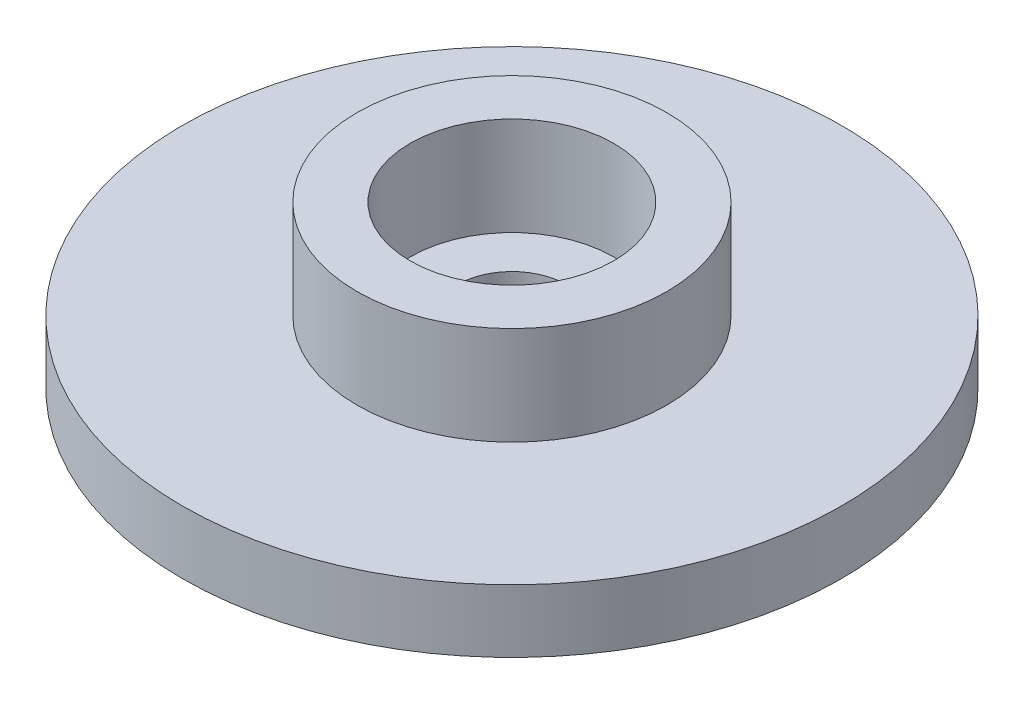
ISO-10303-21;
HEADER;
FILE_DESCRIPTION(('STEP AP214'),'2;1');
FILE_NAME('part.step','',(''),(''),'','','');
FILE_SCHEMA(('AUTOMOTIVE_DESIGN { 1 0 10303 214 1 1 1 1 }'));
ENDSEC;
DATA;
#1=APPLICATION_CONTEXT('core data for automotive mechanical design processes');
#2=APPLICATION_PROTOCOL_DEFINITION('international standard','automotive_design',2000,#1);
#3=PRODUCT_CONTEXT('',#1,'mechanical');
#4=PRODUCT('Part','Part','',(#3));
#5=PRODUCT_RELATED_PRODUCT_CATEGORY('part','',(#4));
#6=PRODUCT_DEFINITION_FORMATION('','',#4);
#7=PRODUCT_DEFINITION_CONTEXT('part definition',#1,'design');
#8=PRODUCT_DEFINITION('design','',#6,#7);
#9=PRODUCT_DEFINITION_SHAPE('','',#8);
#10=(LENGTH_UNIT() NAMED_UNIT(*) SI_UNIT(.MILLI.,.METRE.));
#11=(NAMED_UNIT(*) PLANE_ANGLE_UNIT() SI_UNIT($,.RADIAN.));
#12=(NAMED_UNIT(*) SI_UNIT($,.STERADIAN.) SOLID_ANGLE_UNIT());
#13=UNCERTAINTY_MEASURE_WITH_UNIT(LENGTH_MEASURE(1.E-05),#10,'distance_accuracy_value','');
#14=(GEOMETRIC_REPRESENTATION_CONTEXT(3) GLOBAL_UNCERTAINTY_ASSIGNED_CONTEXT((#13)) GLOBAL_UNIT_ASSIGNED_CONTEXT((#10,
#11,#12)) REPRESENTATION_CONTEXT('',''));
#15=CARTESIAN_POINT('',(0.,0.,0.));
#16=DIRECTION('',(0.,0.,1.));
#17=DIRECTION('',(1.,0.,0.));
#18=AXIS2_PLACEMENT_3D('',#15,#16,#17);
#19=CARTESIAN_POINT('',(0.,1.6256,0.));
#20=DIRECTION('',(0.,-1.,0.));
#21=DIRECTION('',(0.,0.,-1.));
#22=AXIS2_PLACEMENT_3D('',#19,#20,#21);
#23=CYLINDRICAL_SURFACE('',#22,8.509);
#24=CARTESIAN_POINT('',(0.,1.6256,0.));
#25=DIRECTION('',(0.,1.,0.));
#26=DIRECTION('',(0.,0.,1.));
#27=AXIS2_PLACEMENT_3D('',#24,#25,#26);
#28=CIRCLE('',#27,8.509);
#29=CARTESIAN_POINT('',(0.,1.6256,8.509));
#30=VERTEX_POINT('',#29);
#31=EDGE_CURVE('E51',#30,#30,#28,.T.);
#32=ORIENTED_EDGE('',*,*,#31,.F.);
#33=EDGE_LOOP('',(#32));
#34=FACE_BOUND('',#33,.T.);
#35=CARTESIAN_POINT('',(0.,0.,0.));
#36=DIRECTION('',(0.,1.,0.));
#37=DIRECTION('',(0.,0.,1.));
#38=AXIS2_PLACEMENT_3D('',#35,#36,#37);
#39=CIRCLE('',#38,8.509);
#40=CARTESIAN_POINT('',(0.,0.,8.509));
#41=VERTEX_POINT('',#40);
#42=EDGE_CURVE('E60',#41,#41,#39,.T.);
#43=ORIENTED_EDGE('',*,*,#42,.T.);
#44=EDGE_LOOP('',(#43));
#45=FACE_BOUND('',#44,.T.);
#46=ADVANCED_FACE('F37',(#34,#45),#23,.T.);
#47=CARTESIAN_POINT('',(0.,1.6256,0.));
#48=DIRECTION('',(0.,1.,0.));
#49=DIRECTION('',(0.,0.,1.));
#50=AXIS2_PLACEMENT_3D('',#47,#48,#49);
#51=PLANE('',#50);
#52=CARTESIAN_POINT('',(0.,1.6256,0.));
#53=DIRECTION('',(0.,1.,0.));
#54=DIRECTION('',(0.,0.,1.));
#55=AXIS2_PLACEMENT_3D('',#52,#53,#54);
#56=CIRCLE('',#55,4.0005);
#57=CARTESIAN_POINT('',(0.,1.6256,4.0005));
#58=VERTEX_POINT('',#57);
#59=EDGE_CURVE('E45',#58,#58,#56,.T.);
#60=ORIENTED_EDGE('',*,*,#59,.F.);
#61=EDGE_LOOP('',(#60));
#62=FACE_BOUND('',#61,.T.);
#63=ORIENTED_EDGE('',*,*,#31,.T.);
#64=EDGE_LOOP('',(#63));
#65=FACE_BOUND('',#64,.T.);
#66=ADVANCED_FACE('F72',(#62,#65),#51,.T.);
#67=CARTESIAN_POINT('',(0.,0.,0.));
#68=DIRECTION('',(0.,1.,0.));
#69=DIRECTION('',(0.,0.,1.));
#70=AXIS2_PLACEMENT_3D('',#67,#68,#69);
#71=PLANE('',#70);
#72=CARTESIAN_POINT('',(0.,0.,0.));
#73=DIRECTION('',(0.,-1.,0.));
#74=DIRECTION('',(0.,0.,-1.));
#75=AXIS2_PLACEMENT_3D('',#72,#73,#74);
#76=CIRCLE('',#75,3.5179);
#77=CARTESIAN_POINT('',(0.,0.,3.5179));
#78=VERTEX_POINT('',#77);
#79=EDGE_CURVE('E10',#78,#78,#76,.T.);
#80=ORIENTED_EDGE('',*,*,#79,.F.);
#81=EDGE_LOOP('',(#80));
#82=FACE_BOUND('',#81,.T.);
#83=ORIENTED_EDGE('',*,*,#42,.F.);
#84=EDGE_LOOP('',(#83));
#85=FACE_BOUND('',#84,.T.);
#86=ADVANCED_FACE('F69',(#82,#85),#71,.F.);
#87=CARTESIAN_POINT('',(0.,4.1656,0.));
#88=DIRECTION('',(0.,-1.,0.));
#89=DIRECTION('',(0.,0.,-1.));
#90=AXIS2_PLACEMENT_3D('',#87,#88,#89);
#91=CYLINDRICAL_SURFACE('',#90,4.0005);
#92=CARTESIAN_POINT('',(0.,4.1656,0.));
#93=DIRECTION('',(0.,1.,0.));
#94=DIRECTION('',(0.,0.,1.));
#95=AXIS2_PLACEMENT_3D('',#92,#93,#94);
#96=CIRCLE('',#95,4.0005);
#97=CARTESIAN_POINT('',(0.,4.1656,4.0005));
#98=VERTEX_POINT('',#97);
#99=EDGE_CURVE('E57',#98,#98,#96,.T.);
#100=ORIENTED_EDGE('',*,*,#99,.F.);
#101=EDGE_LOOP('',(#100));
#102=FACE_BOUND('',#101,.T.);
#103=ORIENTED_EDGE('',*,*,#59,.T.);
#104=EDGE_LOOP('',(#103));
#105=FACE_BOUND('',#104,.T.);
#106=ADVANCED_FACE('F71',(#102,#105),#91,.T.);
#107=CARTESIAN_POINT('',(0.,4.1656,0.));
#108=DIRECTION('',(0.,1.,0.));
#109=DIRECTION('',(0.,0.,1.));
#110=AXIS2_PLACEMENT_3D('',#107,#108,#109);
#111=PLANE('',#110);
#112=CARTESIAN_POINT('',(0.,4.1656,0.));
#113=DIRECTION('',(0.,1.,0.));
#114=DIRECTION('',(0.,0.,1.));
#115=AXIS2_PLACEMENT_3D('',#112,#113,#114);
#116=CIRCLE('',#115,2.6289);
#117=CARTESIAN_POINT('',(0.,4.1656,2.6289));
#118=VERTEX_POINT('',#117);
#119=EDGE_CURVE('E193',#118,#118,#116,.T.);
#120=ORIENTED_EDGE('',*,*,#119,.F.);
#121=EDGE_LOOP('',(#120));
#122=FACE_BOUND('',#121,.T.);
#123=ORIENTED_EDGE('',*,*,#99,.T.);
#124=EDGE_LOOP('',(#123));
#125=FACE_BOUND('',#124,.T.);
#126=ADVANCED_FACE('F78',(#122,#125),#111,.T.);
#127=CARTESIAN_POINT('',(0.,-0.762,0.));
#128=DIRECTION('',(0.,1.,0.));
#129=DIRECTION('',(0.,0.,1.));
#130=AXIS2_PLACEMENT_3D('',#127,#128,#129);
#131=CYLINDRICAL_SURFACE('',#130,3.5179);
#132=CARTESIAN_POINT('',(0.,-0.762,0.));
#133=DIRECTION('',(0.,-1.,0.));
#134=DIRECTION('',(0.,0.,-1.));
#135=AXIS2_PLACEMENT_3D('',#132,#133,#134);
#136=CIRCLE('',#135,3.5179);
#137=CARTESIAN_POINT('',(0.,-0.762,3.5179));
#138=VERTEX_POINT('',#137);
#139=EDGE_CURVE('E55',#138,#138,#136,.T.);
#140=CARTESIAN_POINT('',(0.,-0.762,3.5179));
#141=CARTESIAN_POINT('',(0.,-0.7540625,3.5179));
#142=CARTESIAN_POINT('',(0.,-0.746125,3.5179));
#143=CARTESIAN_POINT('',(0.,-0.73025,3.5179));
#144=CARTESIAN_POINT('',(0.,-0.7223125,3.5179));
#145=CARTESIAN_POINT('',(0.,-0.7064375,3.5179));
#146=CARTESIAN_POINT('',(0.,-0.6985,3.5179));
#147=CARTESIAN_POINT('',(0.,-0.682625,3.5179));
#148=CARTESIAN_POINT('',(0.,-0.6746875,3.5179));
#149=CARTESIAN_POINT('',(0.,-0.6588125,3.5179));
#150=CARTESIAN_POINT('',(0.,-0.650875,3.5179));
#151=CARTESIAN_POINT('',(0.,-0.635,3.5179));
#152=CARTESIAN_POINT('',(0.,-0.6270625,3.5179));
#153=CARTESIAN_POINT('',(0.,-0.6111875,3.5179));
#154=CARTESIAN_POINT('',(0.,-0.60325,3.5179));
#155=CARTESIAN_POINT('',(0.,-0.587375,3.5179));
#156=CARTESIAN_POINT('',(0.,-0.5794375,3.5179));
#157=CARTESIAN_POINT('',(0.,-0.5635625,3.5179));
#158=CARTESIAN_POINT('',(0.,-0.555625,3.5179));
#159=CARTESIAN_POINT('',(0.,-0.53975,3.5179));
#160=CARTESIAN_POINT('',(0.,-0.5318125,3.5179));
#161=CARTESIAN_POINT('',(0.,-0.5159375,3.5179));
#162=CARTESIAN_POINT('',(0.,-0.508,3.5179));
#163=CARTESIAN_POINT('',(0.,-0.492125,3.5179));
#164=CARTESIAN_POINT('',(0.,-0.4841875,3.5179));
#165=CARTESIAN_POINT('',(0.,-0.4683125,3.5179));
#166=CARTESIAN_POINT('',(0.,-0.460375,3.5179));
#167=CARTESIAN_POINT('',(0.,-0.4445,3.5179));
#168=CARTESIAN_POINT('',(0.,-0.4365625,3.5179));
#169=CARTESIAN_POINT('',(0.,-0.4206875,3.5179));
#170=CARTESIAN_POINT('',(0.,-0.41275,3.5179));
#171=CARTESIAN_POINT('',(0.,-0.396875,3.5179));
#172=CARTESIAN_POINT('',(0.,-0.3889375,3.5179));
#173=CARTESIAN_POINT('',(0.,-0.3730625,3.5179));
#174=CARTESIAN_POINT('',(0.,-0.365125,3.5179));
#175=CARTESIAN_POINT('',(0.,-0.34925,3.5179));
#176=CARTESIAN_POINT('',(0.,-0.3413125,3.5179));
#177=CARTESIAN_POINT('',(0.,-0.3254375,3.5179));
#178=CARTESIAN_POINT('',(0.,-0.3175,3.5179));
#179=CARTESIAN_POINT('',(0.,-0.301625,3.5179));
#180=CARTESIAN_POINT('',(0.,-0.2936875,3.5179));
#181=CARTESIAN_POINT('',(0.,-0.2778125,3.5179));
#182=CARTESIAN_POINT('',(0.,-0.269875,3.5179));
#183=CARTESIAN_POINT('',(0.,-0.254,3.5179));
#184=CARTESIAN_POINT('',(0.,-0.2460625,3.5179));
#185=CARTESIAN_POINT('',(0.,-0.2301875,3.5179));
#186=CARTESIAN_POINT('',(0.,-0.22225,3.5179));
#187=CARTESIAN_POINT('',(0.,-0.206375,3.5179));
#188=CARTESIAN_POINT('',(0.,-0.1984375,3.5179));
#189=CARTESIAN_POINT('',(0.,-0.1825625,3.5179));
#190=CARTESIAN_POINT('',(0.,-0.174625,3.5179));
#191=CARTESIAN_POINT('',(0.,-0.15875,3.5179));
#192=CARTESIAN_POINT('',(0.,-0.1508125,3.5179));
#193=CARTESIAN_POINT('',(0.,-0.1349375,3.5179));
#194=CARTESIAN_POINT('',(0.,-0.127,3.5179));
#195=CARTESIAN_POINT('',(0.,-0.111125,3.5179));
#196=CARTESIAN_POINT('',(0.,-0.1031875,3.5179));
#197=CARTESIAN_POINT('',(0.,-0.0873125,3.5179));
#198=CARTESIAN_POINT('',(0.,-0.079375,3.5179));
#199=CARTESIAN_POINT('',(0.,-0.0635,3.5179));
#200=CARTESIAN_POINT('',(0.,-0.0555625,3.5179));
#201=CARTESIAN_POINT('',(0.,-0.0396875,3.5179));
#202=CARTESIAN_POINT('',(0.,-0.03175,3.5179));
#203=CARTESIAN_POINT('',(0.,-0.015875,3.5179));
#204=CARTESIAN_POINT('',(0.,-0.00793749999999999,3.5179));
#205=CARTESIAN_POINT('',(0.,0.,3.5179));
#206=B_SPLINE_CURVE_WITH_KNOTS('',3,(#140,#141,#142,#143,#144,#145,#146,#147,#148,#149,#150,
#151,#152,#153,#154,#155,#156,#157,#158,#159,#160,#161,#162,#163,#164,#165,#166,#167,#168,#169,
#170,#171,#172,#173,#174,#175,#176,#177,#178,#179,#180,#181,#182,#183,#184,#185,#186,#187,#188,
#189,#190,#191,#192,#193,#194,#195,#196,#197,#198,#199,#200,#201,#202,#203,#204,#205),
.UNSPECIFIED.,.F.,.F.,(4,2,2,2,2,2,2,2,2,2,2,2,2,2,2,2,2,2,2,2,2,2,2,2,2,2,2,2,2,2,2,2,4),(0.,
0.0238125,0.0476249999999999,0.0714374999999999,0.09525,0.1190625,0.142875,0.1666875,0.1905,
0.2143125,0.238125,0.2619375,0.28575,0.3095625,0.333375,0.3571875,0.381,0.4048125,0.428625,
0.4524375,0.47625,0.5000625,0.523875,0.5476875,0.5715,0.5953125,0.619125,0.6429375,0.66675,
0.6905625,0.714375,0.7381875,0.762),.UNSPECIFIED.);
#207=EDGE_CURVE('BSEAM110',#138,#78,#206,.T.);
#208=ORIENTED_EDGE('',*,*,#139,.F.);
#209=ORIENTED_EDGE('',*,*,#79,.T.);
#210=ORIENTED_EDGE('',*,*,#207,.T.);
#211=ORIENTED_EDGE('',*,*,#207,.F.);
#212=EDGE_LOOP('',(#208,#210,#209,#211));
#213=FACE_BOUND('',#212,.T.);
#214=ADVANCED_FACE('F110',(#213),#131,.T.);
#215=CARTESIAN_POINT('',(0.,-0.762,0.));
#216=DIRECTION('',(0.,-1.,0.));
#217=DIRECTION('',(0.,0.,-1.));
#218=AXIS2_PLACEMENT_3D('',#215,#216,#217);
#219=PLANE('',#218);
#220=CARTESIAN_POINT('',(0.,-0.762,0.));
#221=DIRECTION('',(0.,-1.,0.));
#222=DIRECTION('',(0.,0.,-1.));
#223=AXIS2_PLACEMENT_3D('',#220,#221,#222);
#224=CIRCLE('',#223,3.0099);
#225=CARTESIAN_POINT('',(0.,-0.762,-3.0099));
#226=VERTEX_POINT('',#225);
#227=EDGE_CURVE('E204',#226,#226,#224,.T.);
#228=ORIENTED_EDGE('',*,*,#227,.F.);
#229=EDGE_LOOP('',(#228));
#230=FACE_BOUND('',#229,.T.);
#231=ORIENTED_EDGE('',*,*,#139,.T.);
#232=EDGE_LOOP('',(#231));
#233=FACE_BOUND('',#232,.T.);
#234=ADVANCED_FACE('F115',(#230,#233),#219,.T.);
#235=CARTESIAN_POINT('',(0.,0.,0.));
#236=DIRECTION('',(0.,1.,0.));
#237=DIRECTION('',(0.,0.,1.));
#238=AXIS2_PLACEMENT_3D('',#235,#236,#237);
#239=PLANE('',#238);
#240=CARTESIAN_POINT('',(0.,0.,0.));
#241=DIRECTION('',(0.,1.,0.));
#242=DIRECTION('',(0.,0.,1.));
#243=AXIS2_PLACEMENT_3D('',#240,#241,#242);
#244=CIRCLE('',#243,1.397);
#245=CARTESIAN_POINT('',(0.,0.,1.397));
#246=VERTEX_POINT('',#245);
#247=EDGE_CURVE('E40',#246,#246,#244,.T.);
#248=ORIENTED_EDGE('',*,*,#247,.T.);
#249=EDGE_LOOP('',(#248));
#250=FACE_BOUND('',#249,.T.);
#251=CARTESIAN_POINT('',(0.,0.,0.));
#252=DIRECTION('',(0.,1.,0.));
#253=DIRECTION('',(0.,0.,1.));
#254=AXIS2_PLACEMENT_3D('',#251,#252,#253);
#255=CIRCLE('',#254,3.0099);
#256=CARTESIAN_POINT('',(0.,0.,3.0099));
#257=VERTEX_POINT('',#256);
#258=EDGE_CURVE('E207',#257,#257,#255,.F.);
#259=ORIENTED_EDGE('',*,*,#258,.T.);
#260=EDGE_LOOP('',(#259));
#261=FACE_BOUND('',#260,.T.);
#262=ADVANCED_FACE('F125',(#250,#261),#239,.F.);
#263=CARTESIAN_POINT('',(0.,8.51328280277356,0.));
#264=DIRECTION('',(0.,-1.,0.));
#265=DIRECTION('',(0.,0.,-1.));
#266=AXIS2_PLACEMENT_3D('',#263,#264,#265);
#267=CYLINDRICAL_SURFACE('',#266,3.0099);
#268=ORIENTED_EDGE('',*,*,#227,.T.);
#269=EDGE_LOOP('',(#268));
#270=FACE_BOUND('',#269,.T.);
#271=ORIENTED_EDGE('',*,*,#258,.F.);
#272=EDGE_LOOP('',(#271));
#273=FACE_BOUND('',#272,.T.);
#274=ADVANCED_FACE('F133',(#270,#273),#267,.F.);
#275=CARTESIAN_POINT('',(0.,-5.81005206824526,0.));
#276=DIRECTION('',(0.,1.,0.));
#277=DIRECTION('',(0.,0.,1.));
#278=AXIS2_PLACEMENT_3D('',#275,#276,#277);
#279=CYLINDRICAL_SURFACE('',#278,2.6289);
#280=CARTESIAN_POINT('',(0.,1.6256,0.));
#281=DIRECTION('',(0.,1.,0.));
#282=DIRECTION('',(0.,0.,1.));
#283=AXIS2_PLACEMENT_3D('',#280,#281,#282);
#284=CIRCLE('',#283,2.6289);
#285=CARTESIAN_POINT('',(0.,1.6256,2.6289));
#286=VERTEX_POINT('',#285);
#287=EDGE_CURVE('E197',#286,#286,#284,.F.);
#288=ORIENTED_EDGE('',*,*,#287,.T.);
#289=EDGE_LOOP('',(#288));
#290=FACE_BOUND('',#289,.T.);
#291=ORIENTED_EDGE('',*,*,#119,.T.);
#292=EDGE_LOOP('',(#291));
#293=FACE_BOUND('',#292,.T.);
#294=ADVANCED_FACE('F138',(#290,#293),#279,.F.);
#295=CARTESIAN_POINT('',(0.,1.6256,0.));
#296=DIRECTION('',(0.,1.,0.));
#297=DIRECTION('',(0.,0.,1.));
#298=AXIS2_PLACEMENT_3D('',#295,#296,#297);
#299=PLANE('',#298);
#300=CARTESIAN_POINT('',(0.,1.6256,0.));
#301=DIRECTION('',(0.,1.,0.));
#302=DIRECTION('',(0.,0.,1.));
#303=AXIS2_PLACEMENT_3D('',#300,#301,#302);
#304=CIRCLE('',#303,1.397);
#305=CARTESIAN_POINT('',(0.,1.6256,1.397));
#306=VERTEX_POINT('',#305);
#307=EDGE_CURVE('E189',#306,#306,#304,.T.);
#308=ORIENTED_EDGE('',*,*,#307,.F.);
#309=EDGE_LOOP('',(#308));
#310=FACE_BOUND('',#309,.T.);
#311=ORIENTED_EDGE('',*,*,#287,.F.);
#312=EDGE_LOOP('',(#311));
#313=FACE_BOUND('',#312,.T.);
#314=ADVANCED_FACE('F155',(#310,#313),#299,.T.);
#315=CARTESIAN_POINT('',(0.,-0.762,0.));
#316=DIRECTION('',(0.,1.,0.));
#317=DIRECTION('',(0.,0.,1.));
#318=AXIS2_PLACEMENT_3D('',#315,#316,#317);
#319=CYLINDRICAL_SURFACE('',#318,1.397);
#320=ORIENTED_EDGE('',*,*,#307,.T.);
#321=EDGE_LOOP('',(#320));
#322=FACE_BOUND('',#321,.T.);
#323=ORIENTED_EDGE('',*,*,#247,.F.);
#324=EDGE_LOOP('',(#323));
#325=FACE_BOUND('',#324,.T.);
#326=ADVANCED_FACE('F172',(#322,#325),#319,.F.);
#327=CLOSED_SHELL('',(#46,#66,#86,#106,#126,#214,#234,#262,#274,#294,#314,#326));
#328=MANIFOLD_SOLID_BREP('B2',#327);
#329=ADVANCED_BREP_SHAPE_REPRESENTATION('',(#18,#328),#14);
#330=SHAPE_DEFINITION_REPRESENTATION(#9,#329);
ENDSEC;
END-ISO-10303-21;
